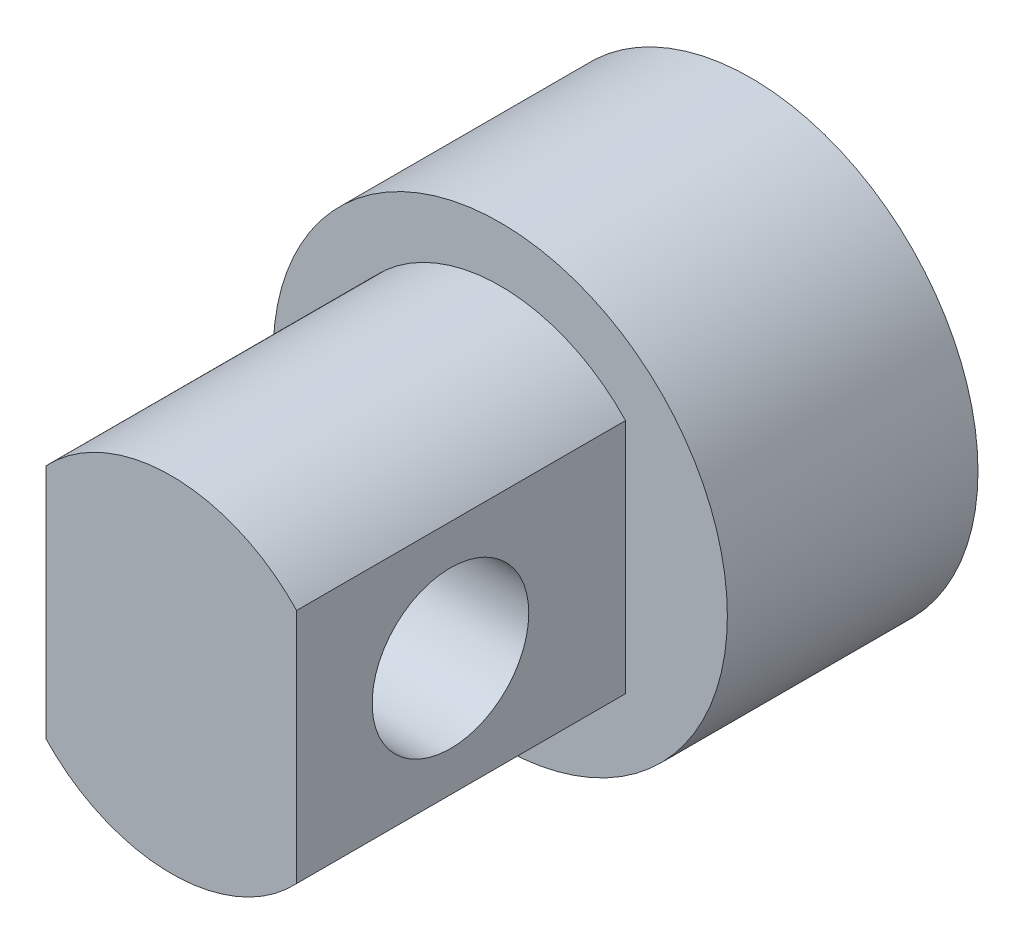
ISO-10303-21;
HEADER;
FILE_DESCRIPTION(('STEP AP214'),'2;1');
FILE_NAME('part.step','',(''),(''),'','','');
FILE_SCHEMA(('AUTOMOTIVE_DESIGN { 1 0 10303 214 1 1 1 1 }'));
ENDSEC;
DATA;
#1=APPLICATION_CONTEXT('core data for automotive mechanical design processes');
#2=APPLICATION_PROTOCOL_DEFINITION('international standard','automotive_design',2000,#1);
#3=PRODUCT_CONTEXT('',#1,'mechanical');
#4=PRODUCT('Part','Part','',(#3));
#5=PRODUCT_RELATED_PRODUCT_CATEGORY('part','',(#4));
#6=PRODUCT_DEFINITION_FORMATION('','',#4);
#7=PRODUCT_DEFINITION_CONTEXT('part definition',#1,'design');
#8=PRODUCT_DEFINITION('design','',#6,#7);
#9=PRODUCT_DEFINITION_SHAPE('','',#8);
#10=(LENGTH_UNIT() NAMED_UNIT(*) SI_UNIT(.MILLI.,.METRE.));
#11=(NAMED_UNIT(*) PLANE_ANGLE_UNIT() SI_UNIT($,.RADIAN.));
#12=(NAMED_UNIT(*) SI_UNIT($,.STERADIAN.) SOLID_ANGLE_UNIT());
#13=UNCERTAINTY_MEASURE_WITH_UNIT(LENGTH_MEASURE(1.E-05),#10,'distance_accuracy_value','');
#14=(GEOMETRIC_REPRESENTATION_CONTEXT(3) GLOBAL_UNCERTAINTY_ASSIGNED_CONTEXT((#13)) GLOBAL_UNIT_ASSIGNED_CONTEXT((#10,
#11,#12)) REPRESENTATION_CONTEXT('',''));
#15=CARTESIAN_POINT('',(0.,0.,0.));
#16=DIRECTION('',(0.,0.,1.));
#17=DIRECTION('',(1.,0.,0.));
#18=AXIS2_PLACEMENT_3D('',#15,#16,#17);
#19=CARTESIAN_POINT('',(0.,0.,21.));
#20=DIRECTION('',(0.,0.,-1.));
#21=DIRECTION('',(-1.,0.,0.));
#22=AXIS2_PLACEMENT_3D('',#19,#20,#21);
#23=CYLINDRICAL_SURFACE('',#22,11.);
#24=CARTESIAN_POINT('',(0.,0.,0.));
#25=DIRECTION('',(0.,0.,1.));
#26=DIRECTION('',(1.,0.,0.));
#27=AXIS2_PLACEMENT_3D('',#24,#25,#26);
#28=CIRCLE('',#27,11.);
#29=CARTESIAN_POINT('',(-8.,-7.54983443527075,0.));
#30=VERTEX_POINT('',#29);
#31=CARTESIAN_POINT('',(8.,-7.54983443527075,0.));
#32=VERTEX_POINT('',#31);
#33=EDGE_CURVE('E75',#30,#32,#28,.T.);
#34=ORIENTED_EDGE('',*,*,#33,.T.);
#35=DIRECTION('',(0.,0.,-1.));
#36=VECTOR('',#35,1.);
#37=CARTESIAN_POINT('',(8.,-7.54983443527075,21.));
#38=LINE('',#37,#36);
#39=CARTESIAN_POINT('',(8.,-7.54983443527075,21.));
#40=VERTEX_POINT('',#39);
#41=EDGE_CURVE('E11',#40,#32,#38,.T.);
#42=ORIENTED_EDGE('',*,*,#41,.F.);
#43=CARTESIAN_POINT('',(0.,0.,21.));
#44=DIRECTION('',(0.,0.,1.));
#45=DIRECTION('',(1.,0.,0.));
#46=AXIS2_PLACEMENT_3D('',#43,#44,#45);
#47=CIRCLE('',#46,11.);
#48=CARTESIAN_POINT('',(-8.,-7.54983443527075,21.));
#49=VERTEX_POINT('',#48);
#50=EDGE_CURVE('E79',#49,#40,#47,.T.);
#51=ORIENTED_EDGE('',*,*,#50,.F.);
#52=DIRECTION('',(0.,0.,-1.));
#53=VECTOR('',#52,1.);
#54=CARTESIAN_POINT('',(-8.,-7.54983443527075,21.));
#55=LINE('',#54,#53);
#56=EDGE_CURVE('E91',#49,#30,#55,.T.);
#57=ORIENTED_EDGE('',*,*,#56,.T.);
#58=EDGE_LOOP('',(#34,#42,#51,#57));
#59=FACE_BOUND('',#58,.T.);
#60=ADVANCED_FACE('F32',(#59),#23,.T.);
#61=CARTESIAN_POINT('',(8.,7.54983443527075,21.));
#62=DIRECTION('',(-1.,0.,0.));
#63=DIRECTION('',(0.,0.,1.));
#64=AXIS2_PLACEMENT_3D('',#61,#62,#63);
#65=PLANE('',#64);
#66=CARTESIAN_POINT('',(7.99999999999999,0.,11.1791453767037));
#67=DIRECTION('',(-1.,0.,0.));
#68=DIRECTION('',(0.,0.,1.));
#69=AXIS2_PLACEMENT_3D('',#66,#67,#68);
#70=CIRCLE('',#69,5.);
#71=CARTESIAN_POINT('',(7.99999999999999,0.,6.17914537670374));
#72=VERTEX_POINT('',#71);
#73=EDGE_CURVE('E108',#72,#72,#70,.T.);
#74=ORIENTED_EDGE('',*,*,#73,.T.);
#75=EDGE_LOOP('',(#74));
#76=FACE_BOUND('',#75,.T.);
#77=DIRECTION('',(0.,1.,0.));
#78=VECTOR('',#77,1.);
#79=CARTESIAN_POINT('',(8.,7.54983443527075,0.));
#80=LINE('',#79,#78);
#81=CARTESIAN_POINT('',(8.,7.54983443527075,0.));
#82=VERTEX_POINT('',#81);
#83=EDGE_CURVE('E88',#32,#82,#80,.T.);
#84=ORIENTED_EDGE('',*,*,#83,.T.);
#85=DIRECTION('',(0.,0.,-1.));
#86=VECTOR('',#85,1.);
#87=CARTESIAN_POINT('',(8.,7.54983443527075,21.));
#88=LINE('',#87,#86);
#89=CARTESIAN_POINT('',(8.,7.54983443527075,21.));
#90=VERTEX_POINT('',#89);
#91=EDGE_CURVE('E41',#90,#82,#88,.T.);
#92=ORIENTED_EDGE('',*,*,#91,.F.);
#93=DIRECTION('',(0.,1.,0.));
#94=VECTOR('',#93,1.);
#95=CARTESIAN_POINT('',(8.,7.54983443527075,21.));
#96=LINE('',#95,#94);
#97=EDGE_CURVE('E102',#40,#90,#96,.T.);
#98=ORIENTED_EDGE('',*,*,#97,.F.);
#99=ORIENTED_EDGE('',*,*,#41,.T.);
#100=EDGE_LOOP('',(#84,#92,#98,#99));
#101=FACE_BOUND('',#100,.T.);
#102=ADVANCED_FACE('F130',(#76,#101),#65,.F.);
#103=CARTESIAN_POINT('',(0.,0.,21.));
#104=DIRECTION('',(0.,0.,-1.));
#105=DIRECTION('',(-1.,0.,0.));
#106=AXIS2_PLACEMENT_3D('',#103,#104,#105);
#107=CYLINDRICAL_SURFACE('',#106,11.);
#108=CARTESIAN_POINT('',(0.,0.,0.));
#109=DIRECTION('',(0.,0.,1.));
#110=DIRECTION('',(1.,0.,0.));
#111=AXIS2_PLACEMENT_3D('',#108,#109,#110);
#112=CIRCLE('',#111,11.);
#113=CARTESIAN_POINT('',(-8.,7.54983443527075,0.));
#114=VERTEX_POINT('',#113);
#115=EDGE_CURVE('E72',#82,#114,#112,.T.);
#116=ORIENTED_EDGE('',*,*,#115,.T.);
#117=DIRECTION('',(0.,0.,-1.));
#118=VECTOR('',#117,1.);
#119=CARTESIAN_POINT('',(-8.,7.54983443527075,21.));
#120=LINE('',#119,#118);
#121=CARTESIAN_POINT('',(-8.,7.54983443527075,21.));
#122=VERTEX_POINT('',#121);
#123=EDGE_CURVE('E86',#122,#114,#120,.T.);
#124=ORIENTED_EDGE('',*,*,#123,.F.);
#125=CARTESIAN_POINT('',(0.,0.,21.));
#126=DIRECTION('',(0.,0.,1.));
#127=DIRECTION('',(1.,0.,0.));
#128=AXIS2_PLACEMENT_3D('',#125,#126,#127);
#129=CIRCLE('',#128,11.);
#130=EDGE_CURVE('E100',#90,#122,#129,.T.);
#131=ORIENTED_EDGE('',*,*,#130,.F.);
#132=ORIENTED_EDGE('',*,*,#91,.T.);
#133=EDGE_LOOP('',(#116,#124,#131,#132));
#134=FACE_BOUND('',#133,.T.);
#135=ADVANCED_FACE('F84',(#134),#107,.T.);
#136=CARTESIAN_POINT('',(-8.,7.54983443527075,21.));
#137=DIRECTION('',(1.,0.,0.));
#138=DIRECTION('',(0.,1.,0.));
#139=AXIS2_PLACEMENT_3D('',#136,#137,#138);
#140=PLANE('',#139);
#141=CARTESIAN_POINT('',(-8.,0.,11.1791453767037));
#142=DIRECTION('',(1.,0.,0.));
#143=DIRECTION('',(0.,1.,0.));
#144=AXIS2_PLACEMENT_3D('',#141,#142,#143);
#145=CIRCLE('',#144,5.);
#146=CARTESIAN_POINT('',(-8.,0.,6.17914537670374));
#147=VERTEX_POINT('',#146);
#148=EDGE_CURVE('E35',#147,#147,#145,.T.);
#149=ORIENTED_EDGE('',*,*,#148,.T.);
#150=EDGE_LOOP('',(#149));
#151=FACE_BOUND('',#150,.T.);
#152=DIRECTION('',(0.,-1.,0.));
#153=VECTOR('',#152,1.);
#154=CARTESIAN_POINT('',(-8.,7.54983443527075,0.));
#155=LINE('',#154,#153);
#156=EDGE_CURVE('E69',#114,#30,#155,.T.);
#157=ORIENTED_EDGE('',*,*,#156,.T.);
#158=ORIENTED_EDGE('',*,*,#56,.F.);
#159=DIRECTION('',(0.,-1.,0.));
#160=VECTOR('',#159,1.);
#161=CARTESIAN_POINT('',(-8.,7.54983443527075,21.));
#162=LINE('',#161,#160);
#163=EDGE_CURVE('E48',#122,#49,#162,.T.);
#164=ORIENTED_EDGE('',*,*,#163,.F.);
#165=ORIENTED_EDGE('',*,*,#123,.T.);
#166=EDGE_LOOP('',(#157,#158,#164,#165));
#167=FACE_BOUND('',#166,.T.);
#168=ADVANCED_FACE('F90',(#151,#167),#140,.F.);
#169=CARTESIAN_POINT('',(0.,0.,21.));
#170=DIRECTION('',(0.,0.,1.));
#171=DIRECTION('',(1.,0.,0.));
#172=AXIS2_PLACEMENT_3D('',#169,#170,#171);
#173=PLANE('',#172);
#174=ORIENTED_EDGE('',*,*,#50,.T.);
#175=ORIENTED_EDGE('',*,*,#97,.T.);
#176=ORIENTED_EDGE('',*,*,#130,.T.);
#177=ORIENTED_EDGE('',*,*,#163,.T.);
#178=EDGE_LOOP('',(#174,#175,#176,#177));
#179=FACE_BOUND('',#178,.T.);
#180=ADVANCED_FACE('F137',(#179),#173,.T.);
#181=CARTESIAN_POINT('',(0.,0.,0.));
#182=DIRECTION('',(0.,0.,1.));
#183=DIRECTION('',(1.,0.,0.));
#184=AXIS2_PLACEMENT_3D('',#181,#182,#183);
#185=PLANE('',#184);
#186=CARTESIAN_POINT('',(0.,0.,0.));
#187=DIRECTION('',(0.,0.,1.));
#188=DIRECTION('',(1.,0.,0.));
#189=AXIS2_PLACEMENT_3D('',#186,#187,#188);
#190=CIRCLE('',#189,14.5);
#191=CARTESIAN_POINT('',(14.5,0.,0.));
#192=VERTEX_POINT('',#191);
#193=EDGE_CURVE('E105',#192,#192,#190,.T.);
#194=ORIENTED_EDGE('',*,*,#193,.T.);
#195=EDGE_LOOP('',(#194));
#196=FACE_BOUND('',#195,.T.);
#197=ORIENTED_EDGE('',*,*,#33,.F.);
#198=ORIENTED_EDGE('',*,*,#156,.F.);
#199=ORIENTED_EDGE('',*,*,#115,.F.);
#200=ORIENTED_EDGE('',*,*,#83,.F.);
#201=EDGE_LOOP('',(#197,#198,#199,#200));
#202=FACE_BOUND('',#201,.T.);
#203=ADVANCED_FACE('F71',(#196,#202),#185,.T.);
#204=CARTESIAN_POINT('',(0.,0.,-16.));
#205=DIRECTION('',(0.,0.,1.));
#206=DIRECTION('',(1.,0.,0.));
#207=AXIS2_PLACEMENT_3D('',#204,#205,#206);
#208=CYLINDRICAL_SURFACE('',#207,14.5);
#209=CARTESIAN_POINT('',(0.,0.,-16.));
#210=DIRECTION('',(0.,0.,1.));
#211=DIRECTION('',(1.,0.,0.));
#212=AXIS2_PLACEMENT_3D('',#209,#210,#211);
#213=CIRCLE('',#212,14.5);
#214=CARTESIAN_POINT('',(14.5,0.,-16.));
#215=VERTEX_POINT('',#214);
#216=EDGE_CURVE('E98',#215,#215,#213,.T.);
#217=ORIENTED_EDGE('',*,*,#216,.T.);
#218=EDGE_LOOP('',(#217));
#219=FACE_BOUND('',#218,.T.);
#220=ORIENTED_EDGE('',*,*,#193,.F.);
#221=EDGE_LOOP('',(#220));
#222=FACE_BOUND('',#221,.T.);
#223=ADVANCED_FACE('F126',(#219,#222),#208,.T.);
#224=CARTESIAN_POINT('',(0.,0.,-16.));
#225=DIRECTION('',(0.,0.,1.));
#226=DIRECTION('',(1.,0.,0.));
#227=AXIS2_PLACEMENT_3D('',#224,#225,#226);
#228=PLANE('',#227);
#229=ORIENTED_EDGE('',*,*,#216,.F.);
#230=EDGE_LOOP('',(#229));
#231=FACE_BOUND('',#230,.T.);
#232=ADVANCED_FACE('F121',(#231),#228,.F.);
#233=CARTESIAN_POINT('',(-14.5,0.,11.1791453767037));
#234=DIRECTION('',(1.,0.,0.));
#235=DIRECTION('',(0.,0.,-1.));
#236=AXIS2_PLACEMENT_3D('',#233,#234,#235);
#237=CYLINDRICAL_SURFACE('',#236,5.);
#238=CARTESIAN_POINT('',(-8.,0.,6.17914537670374));
#239=CARTESIAN_POINT('',(-7.83333333333333,0.,6.17914537670374));
#240=CARTESIAN_POINT('',(-7.66666666666667,0.,6.17914537670374));
#241=CARTESIAN_POINT('',(-7.33333333333333,0.,6.17914537670374));
#242=CARTESIAN_POINT('',(-7.16666666666667,0.,6.17914537670374));
#243=CARTESIAN_POINT('',(-6.83333333333333,0.,6.17914537670374));
#244=CARTESIAN_POINT('',(-6.66666666666667,0.,6.17914537670374));
#245=CARTESIAN_POINT('',(-6.33333333333333,0.,6.17914537670374));
#246=CARTESIAN_POINT('',(-6.16666666666667,0.,6.17914537670374));
#247=CARTESIAN_POINT('',(-5.83333333333333,0.,6.17914537670374));
#248=CARTESIAN_POINT('',(-5.66666666666667,0.,6.17914537670374));
#249=CARTESIAN_POINT('',(-5.33333333333333,0.,6.17914537670374));
#250=CARTESIAN_POINT('',(-5.16666666666667,0.,6.17914537670374));
#251=CARTESIAN_POINT('',(-4.83333333333333,0.,6.17914537670374));
#252=CARTESIAN_POINT('',(-4.66666666666667,0.,6.17914537670374));
#253=CARTESIAN_POINT('',(-4.33333333333333,0.,6.17914537670374));
#254=CARTESIAN_POINT('',(-4.16666666666667,0.,6.17914537670374));
#255=CARTESIAN_POINT('',(-3.83333333333333,0.,6.17914537670374));
#256=CARTESIAN_POINT('',(-3.66666666666667,0.,6.17914537670374));
#257=CARTESIAN_POINT('',(-3.33333333333333,0.,6.17914537670374));
#258=CARTESIAN_POINT('',(-3.16666666666667,0.,6.17914537670374));
#259=CARTESIAN_POINT('',(-2.83333333333333,0.,6.17914537670374));
#260=CARTESIAN_POINT('',(-2.66666666666667,0.,6.17914537670374));
#261=CARTESIAN_POINT('',(-2.33333333333334,0.,6.17914537670374));
#262=CARTESIAN_POINT('',(-2.16666666666667,0.,6.17914537670374));
#263=CARTESIAN_POINT('',(-1.83333333333334,0.,6.17914537670374));
#264=CARTESIAN_POINT('',(-1.66666666666667,0.,6.17914537670374));
#265=CARTESIAN_POINT('',(-1.33333333333333,0.,6.17914537670374));
#266=CARTESIAN_POINT('',(-1.16666666666667,0.,6.17914537670374));
#267=CARTESIAN_POINT('',(-0.833333333333334,0.,6.17914537670374));
#268=CARTESIAN_POINT('',(-0.666666666666667,0.,6.17914537670374));
#269=CARTESIAN_POINT('',(-0.333333333333334,0.,6.17914537670374));
#270=CARTESIAN_POINT('',(-0.166666666666668,0.,6.17914537670374));
#271=CARTESIAN_POINT('',(0.166666666666665,0.,6.17914537670374));
#272=CARTESIAN_POINT('',(0.333333333333332,0.,6.17914537670374));
#273=CARTESIAN_POINT('',(0.666666666666665,0.,6.17914537670374));
#274=CARTESIAN_POINT('',(0.833333333333331,0.,6.17914537670374));
#275=CARTESIAN_POINT('',(1.16666666666666,0.,6.17914537670374));
#276=CARTESIAN_POINT('',(1.33333333333333,0.,6.17914537670374));
#277=CARTESIAN_POINT('',(1.66666666666666,0.,6.17914537670374));
#278=CARTESIAN_POINT('',(1.83333333333333,0.,6.17914537670374));
#279=CARTESIAN_POINT('',(2.16666666666666,0.,6.17914537670374));
#280=CARTESIAN_POINT('',(2.33333333333333,0.,6.17914537670374));
#281=CARTESIAN_POINT('',(2.66666666666666,0.,6.17914537670374));
#282=CARTESIAN_POINT('',(2.83333333333333,0.,6.17914537670374));
#283=CARTESIAN_POINT('',(3.16666666666666,0.,6.17914537670374));
#284=CARTESIAN_POINT('',(3.33333333333333,0.,6.17914537670374));
#285=CARTESIAN_POINT('',(3.66666666666666,0.,6.17914537670374));
#286=CARTESIAN_POINT('',(3.83333333333333,0.,6.17914537670374));
#287=CARTESIAN_POINT('',(4.16666666666666,0.,6.17914537670374));
#288=CARTESIAN_POINT('',(4.33333333333333,0.,6.17914537670374));
#289=CARTESIAN_POINT('',(4.66666666666666,0.,6.17914537670374));
#290=CARTESIAN_POINT('',(4.83333333333333,0.,6.17914537670374));
#291=CARTESIAN_POINT('',(5.16666666666666,0.,6.17914537670374));
#292=CARTESIAN_POINT('',(5.33333333333333,0.,6.17914537670374));
#293=CARTESIAN_POINT('',(5.66666666666666,0.,6.17914537670374));
#294=CARTESIAN_POINT('',(5.83333333333333,0.,6.17914537670374));
#295=CARTESIAN_POINT('',(6.16666666666666,0.,6.17914537670374));
#296=CARTESIAN_POINT('',(6.33333333333333,0.,6.17914537670374));
#297=CARTESIAN_POINT('',(6.66666666666666,0.,6.17914537670374));
#298=CARTESIAN_POINT('',(6.83333333333333,0.,6.17914537670374));
#299=CARTESIAN_POINT('',(7.16666666666666,0.,6.17914537670374));
#300=CARTESIAN_POINT('',(7.33333333333333,0.,6.17914537670374));
#301=CARTESIAN_POINT('',(7.66666666666666,0.,6.17914537670374));
#302=CARTESIAN_POINT('',(7.83333333333333,0.,6.17914537670374));
#303=CARTESIAN_POINT('',(7.99999999999999,0.,6.17914537670374));
#304=B_SPLINE_CURVE_WITH_KNOTS('',3,(#238,#239,#240,#241,#242,#243,#244,#245,#246,#247,#248,
#249,#250,#251,#252,#253,#254,#255,#256,#257,#258,#259,#260,#261,#262,#263,#264,#265,#266,#267,
#268,#269,#270,#271,#272,#273,#274,#275,#276,#277,#278,#279,#280,#281,#282,#283,#284,#285,#286,
#287,#288,#289,#290,#291,#292,#293,#294,#295,#296,#297,#298,#299,#300,#301,#302,#303),
.UNSPECIFIED.,.F.,.F.,(4,2,2,2,2,2,2,2,2,2,2,2,2,2,2,2,2,2,2,2,2,2,2,2,2,2,2,2,2,2,2,2,4),(0.,
0.5,1.,1.5,2.,2.5,3.,3.5,4.,4.5,5.,5.5,6.,6.5,7.,7.5,8.,8.5,9.,9.5,10.,10.5,11.,11.5,12.,12.5,
13.,13.5,14.,14.5,15.,15.5,16.),.UNSPECIFIED.);
#305=EDGE_CURVE('BSEAM118',#147,#72,#304,.T.);
#306=ORIENTED_EDGE('',*,*,#148,.F.);
#307=ORIENTED_EDGE('',*,*,#73,.F.);
#308=ORIENTED_EDGE('',*,*,#305,.T.);
#309=ORIENTED_EDGE('',*,*,#305,.F.);
#310=EDGE_LOOP('',(#306,#308,#307,#309));
#311=FACE_BOUND('',#310,.T.);
#312=ADVANCED_FACE('F118',(#311),#237,.F.);
#313=CLOSED_SHELL('',(#60,#102,#135,#168,#180,#203,#223,#232,#312));
#314=MANIFOLD_SOLID_BREP('B2',#313);
#315=ADVANCED_BREP_SHAPE_REPRESENTATION('',(#18,#314),#14);
#316=SHAPE_DEFINITION_REPRESENTATION(#9,#315);
ENDSEC;
END-ISO-10303-21;
